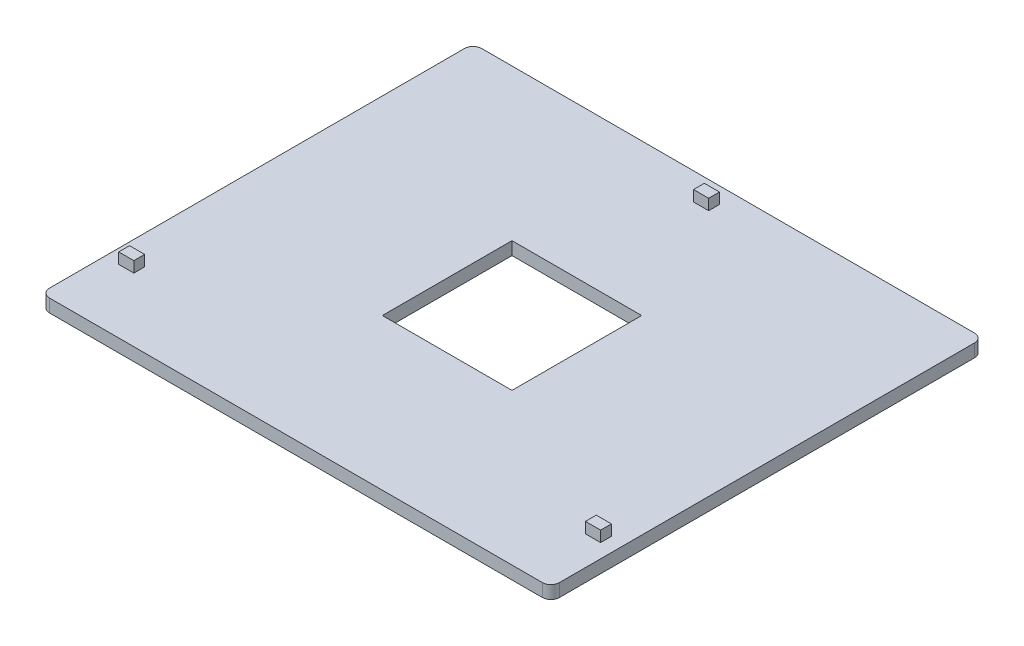
ISO-10303-21;
HEADER;
FILE_DESCRIPTION(('STEP AP214'),'2;1');
FILE_NAME('part.step','',(''),(''),'','','');
FILE_SCHEMA(('AUTOMOTIVE_DESIGN { 1 0 10303 214 1 1 1 1 }'));
ENDSEC;
DATA;
#1=APPLICATION_CONTEXT('core data for automotive mechanical design processes');
#2=APPLICATION_PROTOCOL_DEFINITION('international standard','automotive_design',2000,#1);
#3=PRODUCT_CONTEXT('',#1,'mechanical');
#4=PRODUCT('Part','Part','',(#3));
#5=PRODUCT_RELATED_PRODUCT_CATEGORY('part','',(#4));
#6=PRODUCT_DEFINITION_FORMATION('','',#4);
#7=PRODUCT_DEFINITION_CONTEXT('part definition',#1,'design');
#8=PRODUCT_DEFINITION('design','',#6,#7);
#9=PRODUCT_DEFINITION_SHAPE('','',#8);
#10=(LENGTH_UNIT() NAMED_UNIT(*) SI_UNIT(.MILLI.,.METRE.));
#11=(NAMED_UNIT(*) PLANE_ANGLE_UNIT() SI_UNIT($,.RADIAN.));
#12=(NAMED_UNIT(*) SI_UNIT($,.STERADIAN.) SOLID_ANGLE_UNIT());
#13=UNCERTAINTY_MEASURE_WITH_UNIT(LENGTH_MEASURE(1.E-05),#10,'distance_accuracy_value','');
#14=(GEOMETRIC_REPRESENTATION_CONTEXT(3) GLOBAL_UNCERTAINTY_ASSIGNED_CONTEXT((#13)) GLOBAL_UNIT_ASSIGNED_CONTEXT((#10,
#11,#12)) REPRESENTATION_CONTEXT('',''));
#15=CARTESIAN_POINT('',(0.,0.,0.));
#16=DIRECTION('',(0.,0.,1.));
#17=DIRECTION('',(1.,0.,0.));
#18=AXIS2_PLACEMENT_3D('',#15,#16,#17);
#19=CARTESIAN_POINT('',(0.,3.,0.));
#20=DIRECTION('',(0.,1.,0.));
#21=DIRECTION('',(0.,0.,1.));
#22=AXIS2_PLACEMENT_3D('',#19,#20,#21);
#23=PLANE('',#22);
#24=DIRECTION('',(-1.,0.,0.));
#25=VECTOR('',#24,1.);
#26=CARTESIAN_POINT('',(-59.,3.,-50.));
#27=LINE('',#26,#25);
#28=CARTESIAN_POINT('',(57.,3.,-50.));
#29=VERTEX_POINT('',#28);
#30=CARTESIAN_POINT('',(-57.,3.,-50.));
#31=VERTEX_POINT('',#30);
#32=EDGE_CURVE('E323',#29,#31,#27,.T.);
#33=ORIENTED_EDGE('',*,*,#32,.T.);
#34=CARTESIAN_POINT('',(-57.,3.,-48.));
#35=DIRECTION('',(0.,1.,0.));
#36=DIRECTION('',(0.,0.,1.));
#37=AXIS2_PLACEMENT_3D('',#34,#35,#36);
#38=CIRCLE('',#37,2.);
#39=CARTESIAN_POINT('',(-59.,3.,-48.));
#40=VERTEX_POINT('',#39);
#41=EDGE_CURVE('E363',#31,#40,#38,.T.);
#42=ORIENTED_EDGE('',*,*,#41,.T.);
#43=DIRECTION('',(0.,0.,1.));
#44=VECTOR('',#43,1.);
#45=CARTESIAN_POINT('',(-59.,3.,-50.));
#46=LINE('',#45,#44);
#47=CARTESIAN_POINT('',(-59.,3.,48.));
#48=VERTEX_POINT('',#47);
#49=EDGE_CURVE('E327',#40,#48,#46,.T.);
#50=ORIENTED_EDGE('',*,*,#49,.T.);
#51=CARTESIAN_POINT('',(-57.,3.,48.));
#52=DIRECTION('',(0.,1.,0.));
#53=DIRECTION('',(0.,0.,1.));
#54=AXIS2_PLACEMENT_3D('',#51,#52,#53);
#55=CIRCLE('',#54,2.);
#56=CARTESIAN_POINT('',(-57.,3.,50.));
#57=VERTEX_POINT('',#56);
#58=EDGE_CURVE('E59',#48,#57,#55,.T.);
#59=ORIENTED_EDGE('',*,*,#58,.T.);
#60=DIRECTION('',(1.,0.,0.));
#61=VECTOR('',#60,1.);
#62=CARTESIAN_POINT('',(-59.,3.,50.));
#63=LINE('',#62,#61);
#64=CARTESIAN_POINT('',(57.,3.,50.));
#65=VERTEX_POINT('',#64);
#66=EDGE_CURVE('E329',#57,#65,#63,.T.);
#67=ORIENTED_EDGE('',*,*,#66,.T.);
#68=CARTESIAN_POINT('',(57.,3.,48.));
#69=DIRECTION('',(0.,1.,0.));
#70=DIRECTION('',(0.,0.,1.));
#71=AXIS2_PLACEMENT_3D('',#68,#69,#70);
#72=CIRCLE('',#71,2.);
#73=CARTESIAN_POINT('',(59.,3.,48.));
#74=VERTEX_POINT('',#73);
#75=EDGE_CURVE('E359',#65,#74,#72,.T.);
#76=ORIENTED_EDGE('',*,*,#75,.T.);
#77=DIRECTION('',(0.,0.,-1.));
#78=VECTOR('',#77,1.);
#79=CARTESIAN_POINT('',(59.,3.,-50.));
#80=LINE('',#79,#78);
#81=CARTESIAN_POINT('',(59.,3.,-48.));
#82=VERTEX_POINT('',#81);
#83=EDGE_CURVE('E320',#74,#82,#80,.T.);
#84=ORIENTED_EDGE('',*,*,#83,.T.);
#85=CARTESIAN_POINT('',(57.,3.,-48.));
#86=DIRECTION('',(0.,1.,0.));
#87=DIRECTION('',(0.,0.,1.));
#88=AXIS2_PLACEMENT_3D('',#85,#86,#87);
#89=CIRCLE('',#88,2.);
#90=EDGE_CURVE('E361',#82,#29,#89,.T.);
#91=ORIENTED_EDGE('',*,*,#90,.T.);
#92=EDGE_LOOP('',(#33,#42,#50,#59,#67,#76,#84,#91));
#93=FACE_BOUND('',#92,.T.);
#94=DIRECTION('',(-1.,0.,0.));
#95=VECTOR('',#94,1.);
#96=CARTESIAN_POINT('',(-15.,3.,-15.));
#97=LINE('',#96,#95);
#98=CARTESIAN_POINT('',(15.,3.,-15.));
#99=VERTEX_POINT('',#98);
#100=CARTESIAN_POINT('',(-15.,3.,-15.));
#101=VERTEX_POINT('',#100);
#102=EDGE_CURVE('E294',#99,#101,#97,.T.);
#103=ORIENTED_EDGE('',*,*,#102,.F.);
#104=DIRECTION('',(0.,0.,-1.));
#105=VECTOR('',#104,1.);
#106=CARTESIAN_POINT('',(15.,3.,-15.));
#107=LINE('',#106,#105);
#108=CARTESIAN_POINT('',(15.,3.,15.));
#109=VERTEX_POINT('',#108);
#110=EDGE_CURVE('E292',#109,#99,#107,.T.);
#111=ORIENTED_EDGE('',*,*,#110,.F.);
#112=DIRECTION('',(1.,0.,0.));
#113=VECTOR('',#112,1.);
#114=CARTESIAN_POINT('',(-15.,3.,15.));
#115=LINE('',#114,#113);
#116=CARTESIAN_POINT('',(-15.,3.,15.));
#117=VERTEX_POINT('',#116);
#118=EDGE_CURVE('E300',#117,#109,#115,.T.);
#119=ORIENTED_EDGE('',*,*,#118,.F.);
#120=DIRECTION('',(0.,0.,1.));
#121=VECTOR('',#120,1.);
#122=CARTESIAN_POINT('',(-15.,3.,-15.));
#123=LINE('',#122,#121);
#124=EDGE_CURVE('E297',#101,#117,#123,.T.);
#125=ORIENTED_EDGE('',*,*,#124,.F.);
#126=EDGE_LOOP('',(#103,#111,#119,#125));
#127=FACE_BOUND('',#126,.T.);
#128=DIRECTION('',(-1.,0.,0.));
#129=VECTOR('',#128,1.);
#130=CARTESIAN_POINT('',(-1.75,3.,-46.25));
#131=LINE('',#130,#129);
#132=CARTESIAN_POINT('',(1.75,3.,-46.25));
#133=VERTEX_POINT('',#132);
#134=CARTESIAN_POINT('',(-1.75,3.,-46.25));
#135=VERTEX_POINT('',#134);
#136=EDGE_CURVE('E281',#133,#135,#131,.T.);
#137=ORIENTED_EDGE('',*,*,#136,.F.);
#138=DIRECTION('',(0.,0.,-1.));
#139=VECTOR('',#138,1.);
#140=CARTESIAN_POINT('',(1.75,3.,-46.25));
#141=LINE('',#140,#139);
#142=CARTESIAN_POINT('',(1.75,3.,-43.75));
#143=VERTEX_POINT('',#142);
#144=EDGE_CURVE('E237',#143,#133,#141,.T.);
#145=ORIENTED_EDGE('',*,*,#144,.F.);
#146=DIRECTION('',(1.,0.,0.));
#147=VECTOR('',#146,1.);
#148=CARTESIAN_POINT('',(-1.75,3.,-43.75));
#149=LINE('',#148,#147);
#150=CARTESIAN_POINT('',(-1.75,3.,-43.75));
#151=VERTEX_POINT('',#150);
#152=EDGE_CURVE('E275',#151,#143,#149,.T.);
#153=ORIENTED_EDGE('',*,*,#152,.F.);
#154=DIRECTION('',(0.,0.,1.));
#155=VECTOR('',#154,1.);
#156=CARTESIAN_POINT('',(-1.75,3.,-46.25));
#157=LINE('',#156,#155);
#158=EDGE_CURVE('E277',#135,#151,#157,.T.);
#159=ORIENTED_EDGE('',*,*,#158,.F.);
#160=EDGE_LOOP('',(#137,#145,#153,#159));
#161=FACE_BOUND('',#160,.T.);
#162=DIRECTION('',(-1.,0.,0.));
#163=VECTOR('',#162,1.);
#164=CARTESIAN_POINT('',(55.75,3.,32.75));
#165=LINE('',#164,#163);
#166=CARTESIAN_POINT('',(55.75,3.,32.75));
#167=VERTEX_POINT('',#166);
#168=CARTESIAN_POINT('',(52.25,3.,32.75));
#169=VERTEX_POINT('',#168);
#170=EDGE_CURVE('E252',#167,#169,#165,.T.);
#171=ORIENTED_EDGE('',*,*,#170,.F.);
#172=DIRECTION('',(0.,0.,-1.));
#173=VECTOR('',#172,1.);
#174=CARTESIAN_POINT('',(55.75,3.,32.75));
#175=LINE('',#174,#173);
#176=CARTESIAN_POINT('',(55.75,3.,35.25));
#177=VERTEX_POINT('',#176);
#178=EDGE_CURVE('E254',#177,#167,#175,.T.);
#179=ORIENTED_EDGE('',*,*,#178,.F.);
#180=DIRECTION('',(1.,0.,0.));
#181=VECTOR('',#180,1.);
#182=CARTESIAN_POINT('',(55.75,3.,35.25));
#183=LINE('',#182,#181);
#184=CARTESIAN_POINT('',(52.25,3.,35.25));
#185=VERTEX_POINT('',#184);
#186=EDGE_CURVE('E246',#185,#177,#183,.T.);
#187=ORIENTED_EDGE('',*,*,#186,.F.);
#188=DIRECTION('',(0.,0.,1.));
#189=VECTOR('',#188,1.);
#190=CARTESIAN_POINT('',(52.25,3.,32.75));
#191=LINE('',#190,#189);
#192=EDGE_CURVE('E248',#169,#185,#191,.T.);
#193=ORIENTED_EDGE('',*,*,#192,.F.);
#194=EDGE_LOOP('',(#171,#179,#187,#193));
#195=FACE_BOUND('',#194,.T.);
#196=DIRECTION('',(-1.,0.,0.));
#197=VECTOR('',#196,1.);
#198=CARTESIAN_POINT('',(-55.75,3.,32.75));
#199=LINE('',#198,#197);
#200=CARTESIAN_POINT('',(-52.25,3.,32.75));
#201=VERTEX_POINT('',#200);
#202=CARTESIAN_POINT('',(-55.75,3.,32.75));
#203=VERTEX_POINT('',#202);
#204=EDGE_CURVE('E686',#201,#203,#199,.T.);
#205=ORIENTED_EDGE('',*,*,#204,.F.);
#206=DIRECTION('',(0.,0.,-1.));
#207=VECTOR('',#206,1.);
#208=CARTESIAN_POINT('',(-52.25,3.,32.75));
#209=LINE('',#208,#207);
#210=CARTESIAN_POINT('',(-52.25,3.,35.25));
#211=VERTEX_POINT('',#210);
#212=EDGE_CURVE('E223',#211,#201,#209,.T.);
#213=ORIENTED_EDGE('',*,*,#212,.F.);
#214=DIRECTION('',(1.,0.,0.));
#215=VECTOR('',#214,1.);
#216=CARTESIAN_POINT('',(-55.75,3.,35.25));
#217=LINE('',#216,#215);
#218=CARTESIAN_POINT('',(-55.75,3.,35.25));
#219=VERTEX_POINT('',#218);
#220=EDGE_CURVE('E219',#219,#211,#217,.T.);
#221=ORIENTED_EDGE('',*,*,#220,.F.);
#222=DIRECTION('',(0.,0.,1.));
#223=VECTOR('',#222,1.);
#224=CARTESIAN_POINT('',(-55.75,3.,32.75));
#225=LINE('',#224,#223);
#226=EDGE_CURVE('E689',#203,#219,#225,.T.);
#227=ORIENTED_EDGE('',*,*,#226,.F.);
#228=EDGE_LOOP('',(#205,#213,#221,#227));
#229=FACE_BOUND('',#228,.T.);
#230=ADVANCED_FACE('F39',(#93,#127,#161,#195,#229),#23,.T.);
#231=CARTESIAN_POINT('',(0.,0.,0.));
#232=DIRECTION('',(0.,1.,0.));
#233=DIRECTION('',(0.,0.,1.));
#234=AXIS2_PLACEMENT_3D('',#231,#232,#233);
#235=PLANE('',#234);
#236=DIRECTION('',(0.,0.,1.));
#237=VECTOR('',#236,1.);
#238=CARTESIAN_POINT('',(-59.,0.,-50.));
#239=LINE('',#238,#237);
#240=CARTESIAN_POINT('',(-59.,0.,-48.));
#241=VERTEX_POINT('',#240);
#242=CARTESIAN_POINT('',(-59.,0.,48.));
#243=VERTEX_POINT('',#242);
#244=EDGE_CURVE('E337',#241,#243,#239,.T.);
#245=ORIENTED_EDGE('',*,*,#244,.F.);
#246=CARTESIAN_POINT('',(-57.,0.,-48.));
#247=DIRECTION('',(0.,1.,0.));
#248=DIRECTION('',(0.,0.,1.));
#249=AXIS2_PLACEMENT_3D('',#246,#247,#248);
#250=CIRCLE('',#249,2.);
#251=CARTESIAN_POINT('',(-57.,0.,-50.));
#252=VERTEX_POINT('',#251);
#253=EDGE_CURVE('E351',#241,#252,#250,.F.);
#254=ORIENTED_EDGE('',*,*,#253,.T.);
#255=DIRECTION('',(-1.,0.,0.));
#256=VECTOR('',#255,1.);
#257=CARTESIAN_POINT('',(-59.,0.,-50.));
#258=LINE('',#257,#256);
#259=CARTESIAN_POINT('',(57.,0.,-50.));
#260=VERTEX_POINT('',#259);
#261=EDGE_CURVE('E334',#260,#252,#258,.T.);
#262=ORIENTED_EDGE('',*,*,#261,.F.);
#263=CARTESIAN_POINT('',(57.,0.,-48.));
#264=DIRECTION('',(0.,1.,0.));
#265=DIRECTION('',(0.,0.,1.));
#266=AXIS2_PLACEMENT_3D('',#263,#264,#265);
#267=CIRCLE('',#266,2.);
#268=CARTESIAN_POINT('',(59.,0.,-48.));
#269=VERTEX_POINT('',#268);
#270=EDGE_CURVE('E349',#260,#269,#267,.F.);
#271=ORIENTED_EDGE('',*,*,#270,.T.);
#272=DIRECTION('',(0.,0.,-1.));
#273=VECTOR('',#272,1.);
#274=CARTESIAN_POINT('',(59.,0.,-50.));
#275=LINE('',#274,#273);
#276=CARTESIAN_POINT('',(59.,0.,48.));
#277=VERTEX_POINT('',#276);
#278=EDGE_CURVE('E319',#277,#269,#275,.T.);
#279=ORIENTED_EDGE('',*,*,#278,.F.);
#280=CARTESIAN_POINT('',(57.,0.,48.));
#281=DIRECTION('',(0.,1.,0.));
#282=DIRECTION('',(0.,0.,1.));
#283=AXIS2_PLACEMENT_3D('',#280,#281,#282);
#284=CIRCLE('',#283,2.);
#285=CARTESIAN_POINT('',(57.,0.,50.));
#286=VERTEX_POINT('',#285);
#287=EDGE_CURVE('E347',#277,#286,#284,.F.);
#288=ORIENTED_EDGE('',*,*,#287,.T.);
#289=DIRECTION('',(1.,0.,0.));
#290=VECTOR('',#289,1.);
#291=CARTESIAN_POINT('',(-59.,0.,50.));
#292=LINE('',#291,#290);
#293=CARTESIAN_POINT('',(-57.,0.,50.));
#294=VERTEX_POINT('',#293);
#295=EDGE_CURVE('E324',#294,#286,#292,.T.);
#296=ORIENTED_EDGE('',*,*,#295,.F.);
#297=CARTESIAN_POINT('',(-57.,0.,48.));
#298=DIRECTION('',(0.,1.,0.));
#299=DIRECTION('',(0.,0.,1.));
#300=AXIS2_PLACEMENT_3D('',#297,#298,#299);
#301=CIRCLE('',#300,2.);
#302=EDGE_CURVE('E345',#294,#243,#301,.F.);
#303=ORIENTED_EDGE('',*,*,#302,.T.);
#304=EDGE_LOOP('',(#245,#254,#262,#271,#279,#288,#296,#303));
#305=FACE_BOUND('',#304,.T.);
#306=DIRECTION('',(0.,0.,-1.));
#307=VECTOR('',#306,1.);
#308=CARTESIAN_POINT('',(15.,0.,-15.));
#309=LINE('',#308,#307);
#310=CARTESIAN_POINT('',(15.,0.,15.));
#311=VERTEX_POINT('',#310);
#312=CARTESIAN_POINT('',(15.,0.,-15.));
#313=VERTEX_POINT('',#312);
#314=EDGE_CURVE('E225',#311,#313,#309,.T.);
#315=ORIENTED_EDGE('',*,*,#314,.T.);
#316=DIRECTION('',(-1.,0.,0.));
#317=VECTOR('',#316,1.);
#318=CARTESIAN_POINT('',(-15.,0.,-15.));
#319=LINE('',#318,#317);
#320=CARTESIAN_POINT('',(-15.,0.,-15.));
#321=VERTEX_POINT('',#320);
#322=EDGE_CURVE('E228',#313,#321,#319,.T.);
#323=ORIENTED_EDGE('',*,*,#322,.T.);
#324=DIRECTION('',(0.,0.,1.));
#325=VECTOR('',#324,1.);
#326=CARTESIAN_POINT('',(-15.,0.,-15.));
#327=LINE('',#326,#325);
#328=CARTESIAN_POINT('',(-15.,0.,15.));
#329=VERTEX_POINT('',#328);
#330=EDGE_CURVE('E305',#321,#329,#327,.T.);
#331=ORIENTED_EDGE('',*,*,#330,.T.);
#332=DIRECTION('',(1.,0.,0.));
#333=VECTOR('',#332,1.);
#334=CARTESIAN_POINT('',(-15.,0.,15.));
#335=LINE('',#334,#333);
#336=EDGE_CURVE('E295',#329,#311,#335,.T.);
#337=ORIENTED_EDGE('',*,*,#336,.T.);
#338=EDGE_LOOP('',(#315,#323,#331,#337));
#339=FACE_BOUND('',#338,.T.);
#340=ADVANCED_FACE('F376',(#305,#339),#235,.F.);
#341=CARTESIAN_POINT('',(59.,3.,-50.));
#342=DIRECTION('',(-1.,0.,0.));
#343=DIRECTION('',(0.,0.,1.));
#344=AXIS2_PLACEMENT_3D('',#341,#342,#343);
#345=PLANE('',#344);
#346=ORIENTED_EDGE('',*,*,#278,.T.);
#347=DIRECTION('',(0.,-1.,0.));
#348=VECTOR('',#347,1.);
#349=CARTESIAN_POINT('',(59.,3.,-48.));
#350=LINE('',#349,#348);
#351=EDGE_CURVE('E368',#269,#82,#350,.F.);
#352=ORIENTED_EDGE('',*,*,#351,.T.);
#353=ORIENTED_EDGE('',*,*,#83,.F.);
#354=DIRECTION('',(0.,-1.,0.));
#355=VECTOR('',#354,1.);
#356=CARTESIAN_POINT('',(59.,3.,48.));
#357=LINE('',#356,#355);
#358=EDGE_CURVE('E365',#74,#277,#357,.T.);
#359=ORIENTED_EDGE('',*,*,#358,.T.);
#360=EDGE_LOOP('',(#346,#352,#353,#359));
#361=FACE_BOUND('',#360,.T.);
#362=ADVANCED_FACE('F385',(#361),#345,.F.);
#363=CARTESIAN_POINT('',(-59.,3.,-50.));
#364=DIRECTION('',(0.,0.,1.));
#365=DIRECTION('',(1.,0.,0.));
#366=AXIS2_PLACEMENT_3D('',#363,#364,#365);
#367=PLANE('',#366);
#368=ORIENTED_EDGE('',*,*,#261,.T.);
#369=DIRECTION('',(0.,-1.,0.));
#370=VECTOR('',#369,1.);
#371=CARTESIAN_POINT('',(-57.,3.,-50.));
#372=LINE('',#371,#370);
#373=EDGE_CURVE('E356',#252,#31,#372,.F.);
#374=ORIENTED_EDGE('',*,*,#373,.T.);
#375=ORIENTED_EDGE('',*,*,#32,.F.);
#376=DIRECTION('',(0.,-1.,0.));
#377=VECTOR('',#376,1.);
#378=CARTESIAN_POINT('',(57.,3.,-50.));
#379=LINE('',#378,#377);
#380=EDGE_CURVE('E353',#29,#260,#379,.T.);
#381=ORIENTED_EDGE('',*,*,#380,.T.);
#382=EDGE_LOOP('',(#368,#374,#375,#381));
#383=FACE_BOUND('',#382,.T.);
#384=ADVANCED_FACE('F395',(#383),#367,.F.);
#385=CARTESIAN_POINT('',(-59.,3.,-50.));
#386=DIRECTION('',(1.,0.,0.));
#387=DIRECTION('',(0.,0.,-1.));
#388=AXIS2_PLACEMENT_3D('',#385,#386,#387);
#389=PLANE('',#388);
#390=ORIENTED_EDGE('',*,*,#49,.F.);
#391=DIRECTION('',(0.,-1.,0.));
#392=VECTOR('',#391,1.);
#393=CARTESIAN_POINT('',(-59.,3.,-48.));
#394=LINE('',#393,#392);
#395=EDGE_CURVE('E342',#40,#241,#394,.T.);
#396=ORIENTED_EDGE('',*,*,#395,.T.);
#397=ORIENTED_EDGE('',*,*,#244,.T.);
#398=DIRECTION('',(0.,-1.,0.));
#399=VECTOR('',#398,1.);
#400=CARTESIAN_POINT('',(-59.,3.,48.));
#401=LINE('',#400,#399);
#402=EDGE_CURVE('E331',#243,#48,#401,.F.);
#403=ORIENTED_EDGE('',*,*,#402,.T.);
#404=EDGE_LOOP('',(#390,#396,#397,#403));
#405=FACE_BOUND('',#404,.T.);
#406=ADVANCED_FACE('F403',(#405),#389,.F.);
#407=CARTESIAN_POINT('',(-59.,3.,50.));
#408=DIRECTION('',(0.,0.,-1.));
#409=DIRECTION('',(-1.,0.,0.));
#410=AXIS2_PLACEMENT_3D('',#407,#408,#409);
#411=PLANE('',#410);
#412=ORIENTED_EDGE('',*,*,#295,.T.);
#413=DIRECTION('',(0.,-1.,0.));
#414=VECTOR('',#413,1.);
#415=CARTESIAN_POINT('',(57.,3.,50.));
#416=LINE('',#415,#414);
#417=EDGE_CURVE('E11',#286,#65,#416,.F.);
#418=ORIENTED_EDGE('',*,*,#417,.T.);
#419=ORIENTED_EDGE('',*,*,#66,.F.);
#420=DIRECTION('',(0.,-1.,0.));
#421=VECTOR('',#420,1.);
#422=CARTESIAN_POINT('',(-57.,3.,50.));
#423=LINE('',#422,#421);
#424=EDGE_CURVE('E47',#57,#294,#423,.T.);
#425=ORIENTED_EDGE('',*,*,#424,.T.);
#426=EDGE_LOOP('',(#412,#418,#419,#425));
#427=FACE_BOUND('',#426,.T.);
#428=ADVANCED_FACE('F372',(#427),#411,.F.);
#429=CARTESIAN_POINT('',(15.,3.,-15.));
#430=DIRECTION('',(-1.,0.,0.));
#431=DIRECTION('',(0.,0.,1.));
#432=AXIS2_PLACEMENT_3D('',#429,#430,#431);
#433=PLANE('',#432);
#434=ORIENTED_EDGE('',*,*,#314,.F.);
#435=DIRECTION('',(0.,-1.,0.));
#436=VECTOR('',#435,1.);
#437=CARTESIAN_POINT('',(15.,3.,15.));
#438=LINE('',#437,#436);
#439=EDGE_CURVE('E301',#109,#311,#438,.T.);
#440=ORIENTED_EDGE('',*,*,#439,.F.);
#441=ORIENTED_EDGE('',*,*,#110,.T.);
#442=DIRECTION('',(0.,-1.,0.));
#443=VECTOR('',#442,1.);
#444=CARTESIAN_POINT('',(15.,3.,-15.));
#445=LINE('',#444,#443);
#446=EDGE_CURVE('E316',#99,#313,#445,.T.);
#447=ORIENTED_EDGE('',*,*,#446,.T.);
#448=EDGE_LOOP('',(#434,#440,#441,#447));
#449=FACE_BOUND('',#448,.T.);
#450=ADVANCED_FACE('F417',(#449),#433,.T.);
#451=CARTESIAN_POINT('',(-15.,3.,-15.));
#452=DIRECTION('',(0.,0.,1.));
#453=DIRECTION('',(1.,0.,0.));
#454=AXIS2_PLACEMENT_3D('',#451,#452,#453);
#455=PLANE('',#454);
#456=ORIENTED_EDGE('',*,*,#322,.F.);
#457=ORIENTED_EDGE('',*,*,#446,.F.);
#458=ORIENTED_EDGE('',*,*,#102,.T.);
#459=DIRECTION('',(0.,-1.,0.));
#460=VECTOR('',#459,1.);
#461=CARTESIAN_POINT('',(-15.,3.,-15.));
#462=LINE('',#461,#460);
#463=EDGE_CURVE('E314',#101,#321,#462,.T.);
#464=ORIENTED_EDGE('',*,*,#463,.T.);
#465=EDGE_LOOP('',(#456,#457,#458,#464));
#466=FACE_BOUND('',#465,.T.);
#467=ADVANCED_FACE('F600',(#466),#455,.T.);
#468=CARTESIAN_POINT('',(-15.,3.,-15.));
#469=DIRECTION('',(1.,0.,0.));
#470=DIRECTION('',(0.,0.,-1.));
#471=AXIS2_PLACEMENT_3D('',#468,#469,#470);
#472=PLANE('',#471);
#473=ORIENTED_EDGE('',*,*,#330,.F.);
#474=ORIENTED_EDGE('',*,*,#463,.F.);
#475=ORIENTED_EDGE('',*,*,#124,.T.);
#476=DIRECTION('',(0.,-1.,0.));
#477=VECTOR('',#476,1.);
#478=CARTESIAN_POINT('',(-15.,3.,15.));
#479=LINE('',#478,#477);
#480=EDGE_CURVE('E312',#117,#329,#479,.T.);
#481=ORIENTED_EDGE('',*,*,#480,.T.);
#482=EDGE_LOOP('',(#473,#474,#475,#481));
#483=FACE_BOUND('',#482,.T.);
#484=ADVANCED_FACE('F591',(#483),#472,.T.);
#485=CARTESIAN_POINT('',(-15.,3.,15.));
#486=DIRECTION('',(0.,0.,-1.));
#487=DIRECTION('',(-1.,0.,0.));
#488=AXIS2_PLACEMENT_3D('',#485,#486,#487);
#489=PLANE('',#488);
#490=ORIENTED_EDGE('',*,*,#336,.F.);
#491=ORIENTED_EDGE('',*,*,#480,.F.);
#492=ORIENTED_EDGE('',*,*,#118,.T.);
#493=ORIENTED_EDGE('',*,*,#439,.T.);
#494=EDGE_LOOP('',(#490,#491,#492,#493));
#495=FACE_BOUND('',#494,.T.);
#496=ADVANCED_FACE('F577',(#495),#489,.T.);
#497=CARTESIAN_POINT('',(1.75,5.5,-46.25));
#498=DIRECTION('',(-1.,0.,0.));
#499=DIRECTION('',(0.,0.,1.));
#500=AXIS2_PLACEMENT_3D('',#497,#498,#499);
#501=PLANE('',#500);
#502=ORIENTED_EDGE('',*,*,#144,.T.);
#503=DIRECTION('',(0.,-1.,0.));
#504=VECTOR('',#503,1.);
#505=CARTESIAN_POINT('',(1.75,5.5,-46.25));
#506=LINE('',#505,#504);
#507=CARTESIAN_POINT('',(1.75,5.5,-46.25));
#508=VERTEX_POINT('',#507);
#509=EDGE_CURVE('E264',#508,#133,#506,.T.);
#510=ORIENTED_EDGE('',*,*,#509,.F.);
#511=DIRECTION('',(0.,0.,-1.));
#512=VECTOR('',#511,1.);
#513=CARTESIAN_POINT('',(1.75,5.5,-46.25));
#514=LINE('',#513,#512);
#515=CARTESIAN_POINT('',(1.75,5.5,-43.75));
#516=VERTEX_POINT('',#515);
#517=EDGE_CURVE('E278',#516,#508,#514,.T.);
#518=ORIENTED_EDGE('',*,*,#517,.F.);
#519=DIRECTION('',(0.,-1.,0.));
#520=VECTOR('',#519,1.);
#521=CARTESIAN_POINT('',(1.75,5.5,-43.75));
#522=LINE('',#521,#520);
#523=EDGE_CURVE('E271',#516,#143,#522,.T.);
#524=ORIENTED_EDGE('',*,*,#523,.T.);
#525=EDGE_LOOP('',(#502,#510,#518,#524));
#526=FACE_BOUND('',#525,.T.);
#527=ADVANCED_FACE('F569',(#526),#501,.F.);
#528=CARTESIAN_POINT('',(-1.75,5.5,-46.25));
#529=DIRECTION('',(0.,0.,1.));
#530=DIRECTION('',(1.,0.,0.));
#531=AXIS2_PLACEMENT_3D('',#528,#529,#530);
#532=PLANE('',#531);
#533=ORIENTED_EDGE('',*,*,#136,.T.);
#534=DIRECTION('',(0.,-1.,0.));
#535=VECTOR('',#534,1.);
#536=CARTESIAN_POINT('',(-1.75,5.5,-46.25));
#537=LINE('',#536,#535);
#538=CARTESIAN_POINT('',(-1.75,5.5,-46.25));
#539=VERTEX_POINT('',#538);
#540=EDGE_CURVE('E266',#539,#135,#537,.T.);
#541=ORIENTED_EDGE('',*,*,#540,.F.);
#542=DIRECTION('',(-1.,0.,0.));
#543=VECTOR('',#542,1.);
#544=CARTESIAN_POINT('',(-1.75,5.5,-46.25));
#545=LINE('',#544,#543);
#546=EDGE_CURVE('E288',#508,#539,#545,.T.);
#547=ORIENTED_EDGE('',*,*,#546,.F.);
#548=ORIENTED_EDGE('',*,*,#509,.T.);
#549=EDGE_LOOP('',(#533,#541,#547,#548));
#550=FACE_BOUND('',#549,.T.);
#551=ADVANCED_FACE('F560',(#550),#532,.F.);
#552=CARTESIAN_POINT('',(-1.75,5.5,-46.25));
#553=DIRECTION('',(1.,0.,0.));
#554=DIRECTION('',(0.,0.,-1.));
#555=AXIS2_PLACEMENT_3D('',#552,#553,#554);
#556=PLANE('',#555);
#557=ORIENTED_EDGE('',*,*,#158,.T.);
#558=DIRECTION('',(0.,-1.,0.));
#559=VECTOR('',#558,1.);
#560=CARTESIAN_POINT('',(-1.75,5.5,-43.75));
#561=LINE('',#560,#559);
#562=CARTESIAN_POINT('',(-1.75,5.5,-43.75));
#563=VERTEX_POINT('',#562);
#564=EDGE_CURVE('E269',#563,#151,#561,.T.);
#565=ORIENTED_EDGE('',*,*,#564,.F.);
#566=DIRECTION('',(0.,0.,1.));
#567=VECTOR('',#566,1.);
#568=CARTESIAN_POINT('',(-1.75,5.5,-46.25));
#569=LINE('',#568,#567);
#570=EDGE_CURVE('E286',#539,#563,#569,.T.);
#571=ORIENTED_EDGE('',*,*,#570,.F.);
#572=ORIENTED_EDGE('',*,*,#540,.T.);
#573=EDGE_LOOP('',(#557,#565,#571,#572));
#574=FACE_BOUND('',#573,.T.);
#575=ADVANCED_FACE('F551',(#574),#556,.F.);
#576=CARTESIAN_POINT('',(-1.75,5.5,-43.75));
#577=DIRECTION('',(0.,0.,-1.));
#578=DIRECTION('',(-1.,0.,0.));
#579=AXIS2_PLACEMENT_3D('',#576,#577,#578);
#580=PLANE('',#579);
#581=ORIENTED_EDGE('',*,*,#152,.T.);
#582=ORIENTED_EDGE('',*,*,#523,.F.);
#583=DIRECTION('',(1.,0.,0.));
#584=VECTOR('',#583,1.);
#585=CARTESIAN_POINT('',(-1.75,5.5,-43.75));
#586=LINE('',#585,#584);
#587=EDGE_CURVE('E274',#563,#516,#586,.T.);
#588=ORIENTED_EDGE('',*,*,#587,.F.);
#589=ORIENTED_EDGE('',*,*,#564,.T.);
#590=EDGE_LOOP('',(#581,#582,#588,#589));
#591=FACE_BOUND('',#590,.T.);
#592=ADVANCED_FACE('F542',(#591),#580,.F.);
#593=CARTESIAN_POINT('',(0.,5.5,0.));
#594=DIRECTION('',(0.,1.,0.));
#595=DIRECTION('',(0.,0.,1.));
#596=AXIS2_PLACEMENT_3D('',#593,#594,#595);
#597=PLANE('',#596);
#598=ORIENTED_EDGE('',*,*,#517,.T.);
#599=ORIENTED_EDGE('',*,*,#546,.T.);
#600=ORIENTED_EDGE('',*,*,#570,.T.);
#601=ORIENTED_EDGE('',*,*,#587,.T.);
#602=EDGE_LOOP('',(#598,#599,#600,#601));
#603=FACE_BOUND('',#602,.T.);
#604=ADVANCED_FACE('F533',(#603),#597,.T.);
#605=CARTESIAN_POINT('',(55.75,5.5,32.75));
#606=DIRECTION('',(-1.,0.,0.));
#607=DIRECTION('',(0.,0.,1.));
#608=AXIS2_PLACEMENT_3D('',#605,#606,#607);
#609=PLANE('',#608);
#610=ORIENTED_EDGE('',*,*,#178,.T.);
#611=DIRECTION('',(0.,-1.,0.));
#612=VECTOR('',#611,1.);
#613=CARTESIAN_POINT('',(55.75,5.5,32.75));
#614=LINE('',#613,#612);
#615=CARTESIAN_POINT('',(55.75,5.5,32.75));
#616=VERTEX_POINT('',#615);
#617=EDGE_CURVE('E234',#616,#167,#614,.T.);
#618=ORIENTED_EDGE('',*,*,#617,.F.);
#619=DIRECTION('',(0.,0.,-1.));
#620=VECTOR('',#619,1.);
#621=CARTESIAN_POINT('',(55.75,5.5,32.75));
#622=LINE('',#621,#620);
#623=CARTESIAN_POINT('',(55.75,5.5,35.25));
#624=VERTEX_POINT('',#623);
#625=EDGE_CURVE('E249',#624,#616,#622,.T.);
#626=ORIENTED_EDGE('',*,*,#625,.F.);
#627=DIRECTION('',(0.,-1.,0.));
#628=VECTOR('',#627,1.);
#629=CARTESIAN_POINT('',(55.75,5.5,35.25));
#630=LINE('',#629,#628);
#631=EDGE_CURVE('E242',#624,#177,#630,.T.);
#632=ORIENTED_EDGE('',*,*,#631,.T.);
#633=EDGE_LOOP('',(#610,#618,#626,#632));
#634=FACE_BOUND('',#633,.T.);
#635=ADVANCED_FACE('F524',(#634),#609,.F.);
#636=CARTESIAN_POINT('',(55.75,5.5,32.75));
#637=DIRECTION('',(0.,0.,1.));
#638=DIRECTION('',(1.,0.,0.));
#639=AXIS2_PLACEMENT_3D('',#636,#637,#638);
#640=PLANE('',#639);
#641=ORIENTED_EDGE('',*,*,#170,.T.);
#642=DIRECTION('',(0.,-1.,0.));
#643=VECTOR('',#642,1.);
#644=CARTESIAN_POINT('',(52.25,5.5,32.75));
#645=LINE('',#644,#643);
#646=CARTESIAN_POINT('',(52.25,5.5,32.75));
#647=VERTEX_POINT('',#646);
#648=EDGE_CURVE('E236',#647,#169,#645,.T.);
#649=ORIENTED_EDGE('',*,*,#648,.F.);
#650=DIRECTION('',(-1.,0.,0.));
#651=VECTOR('',#650,1.);
#652=CARTESIAN_POINT('',(55.75,5.5,32.75));
#653=LINE('',#652,#651);
#654=EDGE_CURVE('E260',#616,#647,#653,.T.);
#655=ORIENTED_EDGE('',*,*,#654,.F.);
#656=ORIENTED_EDGE('',*,*,#617,.T.);
#657=EDGE_LOOP('',(#641,#649,#655,#656));
#658=FACE_BOUND('',#657,.T.);
#659=ADVANCED_FACE('F515',(#658),#640,.F.);
#660=CARTESIAN_POINT('',(52.25,5.5,32.75));
#661=DIRECTION('',(1.,0.,0.));
#662=DIRECTION('',(0.,0.,-1.));
#663=AXIS2_PLACEMENT_3D('',#660,#661,#662);
#664=PLANE('',#663);
#665=ORIENTED_EDGE('',*,*,#192,.T.);
#666=DIRECTION('',(0.,-1.,0.));
#667=VECTOR('',#666,1.);
#668=CARTESIAN_POINT('',(52.25,5.5,35.25));
#669=LINE('',#668,#667);
#670=CARTESIAN_POINT('',(52.25,5.5,35.25));
#671=VERTEX_POINT('',#670);
#672=EDGE_CURVE('E240',#671,#185,#669,.T.);
#673=ORIENTED_EDGE('',*,*,#672,.F.);
#674=DIRECTION('',(0.,0.,1.));
#675=VECTOR('',#674,1.);
#676=CARTESIAN_POINT('',(52.25,5.5,32.75));
#677=LINE('',#676,#675);
#678=EDGE_CURVE('E258',#647,#671,#677,.T.);
#679=ORIENTED_EDGE('',*,*,#678,.F.);
#680=ORIENTED_EDGE('',*,*,#648,.T.);
#681=EDGE_LOOP('',(#665,#673,#679,#680));
#682=FACE_BOUND('',#681,.T.);
#683=ADVANCED_FACE('F506',(#682),#664,.F.);
#684=CARTESIAN_POINT('',(55.75,5.5,35.25));
#685=DIRECTION('',(0.,0.,-1.));
#686=DIRECTION('',(-1.,0.,0.));
#687=AXIS2_PLACEMENT_3D('',#684,#685,#686);
#688=PLANE('',#687);
#689=ORIENTED_EDGE('',*,*,#186,.T.);
#690=ORIENTED_EDGE('',*,*,#631,.F.);
#691=DIRECTION('',(1.,0.,0.));
#692=VECTOR('',#691,1.);
#693=CARTESIAN_POINT('',(55.75,5.5,35.25));
#694=LINE('',#693,#692);
#695=EDGE_CURVE('E245',#671,#624,#694,.T.);
#696=ORIENTED_EDGE('',*,*,#695,.F.);
#697=ORIENTED_EDGE('',*,*,#672,.T.);
#698=EDGE_LOOP('',(#689,#690,#696,#697));
#699=FACE_BOUND('',#698,.T.);
#700=ADVANCED_FACE('F497',(#699),#688,.F.);
#701=CARTESIAN_POINT('',(0.,5.5,0.));
#702=DIRECTION('',(0.,-1.,0.));
#703=DIRECTION('',(0.,0.,-1.));
#704=AXIS2_PLACEMENT_3D('',#701,#702,#703);
#705=PLANE('',#704);
#706=ORIENTED_EDGE('',*,*,#625,.T.);
#707=ORIENTED_EDGE('',*,*,#654,.T.);
#708=ORIENTED_EDGE('',*,*,#678,.T.);
#709=ORIENTED_EDGE('',*,*,#695,.T.);
#710=EDGE_LOOP('',(#706,#707,#708,#709));
#711=FACE_BOUND('',#710,.T.);
#712=ADVANCED_FACE('F489',(#711),#705,.F.);
#713=CARTESIAN_POINT('',(-52.25,5.5,32.75));
#714=DIRECTION('',(-1.,0.,0.));
#715=DIRECTION('',(0.,0.,1.));
#716=AXIS2_PLACEMENT_3D('',#713,#714,#715);
#717=PLANE('',#716);
#718=ORIENTED_EDGE('',*,*,#212,.T.);
#719=DIRECTION('',(0.,-1.,0.));
#720=VECTOR('',#719,1.);
#721=CARTESIAN_POINT('',(-52.25,5.5,32.75));
#722=LINE('',#721,#720);
#723=CARTESIAN_POINT('',(-52.25,5.5,32.75));
#724=VERTEX_POINT('',#723);
#725=EDGE_CURVE('E203',#724,#201,#722,.T.);
#726=ORIENTED_EDGE('',*,*,#725,.F.);
#727=DIRECTION('',(0.,0.,-1.));
#728=VECTOR('',#727,1.);
#729=CARTESIAN_POINT('',(-52.25,5.5,32.75));
#730=LINE('',#729,#728);
#731=CARTESIAN_POINT('',(-52.25,5.5,35.25));
#732=VERTEX_POINT('',#731);
#733=EDGE_CURVE('E210',#732,#724,#730,.T.);
#734=ORIENTED_EDGE('',*,*,#733,.F.);
#735=DIRECTION('',(0.,-1.,0.));
#736=VECTOR('',#735,1.);
#737=CARTESIAN_POINT('',(-52.25,5.5,35.25));
#738=LINE('',#737,#736);
#739=EDGE_CURVE('E696',#732,#211,#738,.T.);
#740=ORIENTED_EDGE('',*,*,#739,.T.);
#741=EDGE_LOOP('',(#718,#726,#734,#740));
#742=FACE_BOUND('',#741,.T.);
#743=ADVANCED_FACE('F221',(#742),#717,.F.);
#744=CARTESIAN_POINT('',(-55.75,5.5,32.75));
#745=DIRECTION('',(0.,0.,1.));
#746=DIRECTION('',(1.,0.,0.));
#747=AXIS2_PLACEMENT_3D('',#744,#745,#746);
#748=PLANE('',#747);
#749=ORIENTED_EDGE('',*,*,#204,.T.);
#750=DIRECTION('',(0.,-1.,0.));
#751=VECTOR('',#750,1.);
#752=CARTESIAN_POINT('',(-55.75,5.5,32.75));
#753=LINE('',#752,#751);
#754=CARTESIAN_POINT('',(-55.75,5.5,32.75));
#755=VERTEX_POINT('',#754);
#756=EDGE_CURVE('E206',#755,#203,#753,.T.);
#757=ORIENTED_EDGE('',*,*,#756,.F.);
#758=DIRECTION('',(-1.,0.,0.));
#759=VECTOR('',#758,1.);
#760=CARTESIAN_POINT('',(-55.75,5.5,32.75));
#761=LINE('',#760,#759);
#762=EDGE_CURVE('E199',#724,#755,#761,.T.);
#763=ORIENTED_EDGE('',*,*,#762,.F.);
#764=ORIENTED_EDGE('',*,*,#725,.T.);
#765=EDGE_LOOP('',(#749,#757,#763,#764));
#766=FACE_BOUND('',#765,.T.);
#767=ADVANCED_FACE('F201',(#766),#748,.F.);
#768=CARTESIAN_POINT('',(-55.75,5.5,32.75));
#769=DIRECTION('',(1.,0.,0.));
#770=DIRECTION('',(0.,0.,-1.));
#771=AXIS2_PLACEMENT_3D('',#768,#769,#770);
#772=PLANE('',#771);
#773=ORIENTED_EDGE('',*,*,#226,.T.);
#774=DIRECTION('',(0.,-1.,0.));
#775=VECTOR('',#774,1.);
#776=CARTESIAN_POINT('',(-55.75,5.5,35.25));
#777=LINE('',#776,#775);
#778=CARTESIAN_POINT('',(-55.75,5.5,35.25));
#779=VERTEX_POINT('',#778);
#780=EDGE_CURVE('E230',#779,#219,#777,.T.);
#781=ORIENTED_EDGE('',*,*,#780,.F.);
#782=DIRECTION('',(0.,0.,1.));
#783=VECTOR('',#782,1.);
#784=CARTESIAN_POINT('',(-55.75,5.5,32.75));
#785=LINE('',#784,#783);
#786=EDGE_CURVE('E209',#755,#779,#785,.T.);
#787=ORIENTED_EDGE('',*,*,#786,.F.);
#788=ORIENTED_EDGE('',*,*,#756,.T.);
#789=EDGE_LOOP('',(#773,#781,#787,#788));
#790=FACE_BOUND('',#789,.T.);
#791=ADVANCED_FACE('F465',(#790),#772,.F.);
#792=CARTESIAN_POINT('',(-55.75,5.5,35.25));
#793=DIRECTION('',(0.,0.,-1.));
#794=DIRECTION('',(-1.,0.,0.));
#795=AXIS2_PLACEMENT_3D('',#792,#793,#794);
#796=PLANE('',#795);
#797=ORIENTED_EDGE('',*,*,#220,.T.);
#798=ORIENTED_EDGE('',*,*,#739,.F.);
#799=DIRECTION('',(1.,0.,0.));
#800=VECTOR('',#799,1.);
#801=CARTESIAN_POINT('',(-55.75,5.5,35.25));
#802=LINE('',#801,#800);
#803=EDGE_CURVE('E215',#779,#732,#802,.T.);
#804=ORIENTED_EDGE('',*,*,#803,.F.);
#805=ORIENTED_EDGE('',*,*,#780,.T.);
#806=EDGE_LOOP('',(#797,#798,#804,#805));
#807=FACE_BOUND('',#806,.T.);
#808=ADVANCED_FACE('F457',(#807),#796,.F.);
#809=CARTESIAN_POINT('',(0.,5.5,0.));
#810=DIRECTION('',(0.,1.,0.));
#811=DIRECTION('',(0.,0.,1.));
#812=AXIS2_PLACEMENT_3D('',#809,#810,#811);
#813=PLANE('',#812);
#814=ORIENTED_EDGE('',*,*,#733,.T.);
#815=ORIENTED_EDGE('',*,*,#762,.T.);
#816=ORIENTED_EDGE('',*,*,#786,.T.);
#817=ORIENTED_EDGE('',*,*,#803,.T.);
#818=EDGE_LOOP('',(#814,#815,#816,#817));
#819=FACE_BOUND('',#818,.T.);
#820=ADVANCED_FACE('F213',(#819),#813,.T.);
#821=CARTESIAN_POINT('',(-57.,3.,-48.));
#822=DIRECTION('',(0.,-1.,0.));
#823=DIRECTION('',(0.,0.,-1.));
#824=AXIS2_PLACEMENT_3D('',#821,#822,#823);
#825=CYLINDRICAL_SURFACE('',#824,2.);
#826=ORIENTED_EDGE('',*,*,#41,.F.);
#827=ORIENTED_EDGE('',*,*,#373,.F.);
#828=ORIENTED_EDGE('',*,*,#253,.F.);
#829=ORIENTED_EDGE('',*,*,#395,.F.);
#830=EDGE_LOOP('',(#826,#827,#828,#829));
#831=FACE_BOUND('',#830,.T.);
#832=ADVANCED_FACE('F400',(#831),#825,.T.);
#833=CARTESIAN_POINT('',(57.,3.,-48.));
#834=DIRECTION('',(0.,-1.,0.));
#835=DIRECTION('',(0.,0.,-1.));
#836=AXIS2_PLACEMENT_3D('',#833,#834,#835);
#837=CYLINDRICAL_SURFACE('',#836,2.);
#838=ORIENTED_EDGE('',*,*,#90,.F.);
#839=ORIENTED_EDGE('',*,*,#351,.F.);
#840=ORIENTED_EDGE('',*,*,#270,.F.);
#841=ORIENTED_EDGE('',*,*,#380,.F.);
#842=EDGE_LOOP('',(#838,#839,#840,#841));
#843=FACE_BOUND('',#842,.T.);
#844=ADVANCED_FACE('F392',(#843),#837,.T.);
#845=CARTESIAN_POINT('',(57.,3.,48.));
#846=DIRECTION('',(0.,-1.,0.));
#847=DIRECTION('',(0.,0.,-1.));
#848=AXIS2_PLACEMENT_3D('',#845,#846,#847);
#849=CYLINDRICAL_SURFACE('',#848,2.);
#850=ORIENTED_EDGE('',*,*,#75,.F.);
#851=ORIENTED_EDGE('',*,*,#417,.F.);
#852=ORIENTED_EDGE('',*,*,#287,.F.);
#853=ORIENTED_EDGE('',*,*,#358,.F.);
#854=EDGE_LOOP('',(#850,#851,#852,#853));
#855=FACE_BOUND('',#854,.T.);
#856=ADVANCED_FACE('F382',(#855),#849,.T.);
#857=CARTESIAN_POINT('',(-57.,3.,48.));
#858=DIRECTION('',(0.,-1.,0.));
#859=DIRECTION('',(0.,0.,-1.));
#860=AXIS2_PLACEMENT_3D('',#857,#858,#859);
#861=CYLINDRICAL_SURFACE('',#860,2.);
#862=ORIENTED_EDGE('',*,*,#58,.F.);
#863=ORIENTED_EDGE('',*,*,#402,.F.);
#864=ORIENTED_EDGE('',*,*,#302,.F.);
#865=ORIENTED_EDGE('',*,*,#424,.F.);
#866=EDGE_LOOP('',(#862,#863,#864,#865));
#867=FACE_BOUND('',#866,.T.);
#868=ADVANCED_FACE('F41',(#867),#861,.T.);
#869=CLOSED_SHELL('',(#230,#340,#362,#384,#406,#428,#450,#467,#484,#496,#527,#551,#575,#592,
#604,#635,#659,#683,#700,#712,#743,#767,#791,#808,#820,#832,#844,#856,#868));
#870=MANIFOLD_SOLID_BREP('B2',#869);
#871=ADVANCED_BREP_SHAPE_REPRESENTATION('',(#18,#870),#14);
#872=SHAPE_DEFINITION_REPRESENTATION(#9,#871);
ENDSEC;
END-ISO-10303-21;
